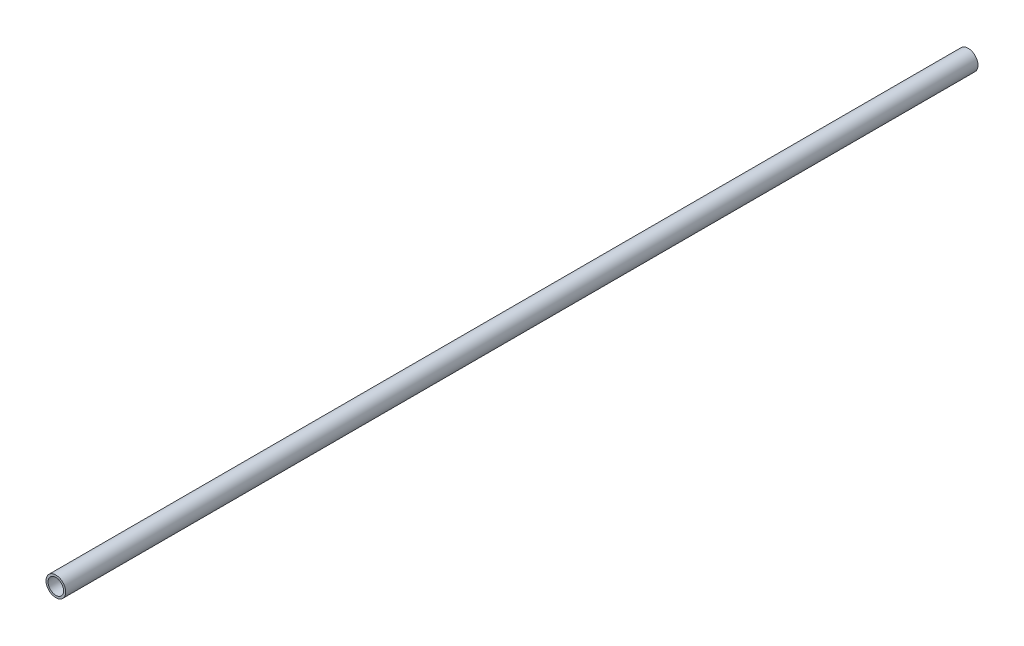
ISO-10303-21;
HEADER;
FILE_DESCRIPTION(('STEP AP214'),'2;1');
FILE_NAME('part.step','',(''),(''),'','','');
FILE_SCHEMA(('AUTOMOTIVE_DESIGN { 1 0 10303 214 1 1 1 1 }'));
ENDSEC;
DATA;
#1=APPLICATION_CONTEXT('core data for automotive mechanical design processes');
#2=APPLICATION_PROTOCOL_DEFINITION('international standard','automotive_design',2000,#1);
#3=PRODUCT_CONTEXT('',#1,'mechanical');
#4=PRODUCT('Part','Part','',(#3));
#5=PRODUCT_RELATED_PRODUCT_CATEGORY('part','',(#4));
#6=PRODUCT_DEFINITION_FORMATION('','',#4);
#7=PRODUCT_DEFINITION_CONTEXT('part definition',#1,'design');
#8=PRODUCT_DEFINITION('design','',#6,#7);
#9=PRODUCT_DEFINITION_SHAPE('','',#8);
#10=(LENGTH_UNIT() NAMED_UNIT(*) SI_UNIT(.MILLI.,.METRE.));
#11=(NAMED_UNIT(*) PLANE_ANGLE_UNIT() SI_UNIT($,.RADIAN.));
#12=(NAMED_UNIT(*) SI_UNIT($,.STERADIAN.) SOLID_ANGLE_UNIT());
#13=UNCERTAINTY_MEASURE_WITH_UNIT(LENGTH_MEASURE(1.E-05),#10,'distance_accuracy_value','');
#14=(GEOMETRIC_REPRESENTATION_CONTEXT(3) GLOBAL_UNCERTAINTY_ASSIGNED_CONTEXT((#13)) GLOBAL_UNIT_ASSIGNED_CONTEXT((#10,
#11,#12)) REPRESENTATION_CONTEXT('',''));
#15=CARTESIAN_POINT('',(0.,0.,0.));
#16=DIRECTION('',(0.,0.,1.));
#17=DIRECTION('',(1.,0.,0.));
#18=AXIS2_PLACEMENT_3D('',#15,#16,#17);
#19=CARTESIAN_POINT('',(0.,0.,558.8));
#20=DIRECTION('',(0.,0.,1.));
#21=DIRECTION('',(1.,0.,0.));
#22=AXIS2_PLACEMENT_3D('',#19,#20,#21);
#23=PLANE('',#22);
#24=CARTESIAN_POINT('',(0.,0.,558.8));
#25=DIRECTION('',(0.,0.,1.));
#26=DIRECTION('',(1.,0.,0.));
#27=AXIS2_PLACEMENT_3D('',#24,#25,#26);
#28=CIRCLE('',#27,12.065);
#29=CARTESIAN_POINT('',(12.065,0.,558.8));
#30=VERTEX_POINT('',#29);
#31=EDGE_CURVE('E10',#30,#30,#28,.T.);
#32=ORIENTED_EDGE('',*,*,#31,.T.);
#33=EDGE_LOOP('',(#32));
#34=FACE_BOUND('',#33,.T.);
#35=CARTESIAN_POINT('',(0.,0.,558.8));
#36=DIRECTION('',(0.,0.,1.));
#37=DIRECTION('',(1.,0.,0.));
#38=AXIS2_PLACEMENT_3D('',#35,#36,#37);
#39=CIRCLE('',#38,9.525);
#40=CARTESIAN_POINT('',(9.525,0.,558.8));
#41=VERTEX_POINT('',#40);
#42=EDGE_CURVE('E48',#41,#41,#39,.T.);
#43=ORIENTED_EDGE('',*,*,#42,.F.);
#44=EDGE_LOOP('',(#43));
#45=FACE_BOUND('',#44,.T.);
#46=ADVANCED_FACE('F37',(#34,#45),#23,.T.);
#47=CARTESIAN_POINT('',(0.,0.,-558.8));
#48=DIRECTION('',(0.,0.,1.));
#49=DIRECTION('',(1.,0.,0.));
#50=AXIS2_PLACEMENT_3D('',#47,#48,#49);
#51=PLANE('',#50);
#52=CARTESIAN_POINT('',(0.,0.,-558.8));
#53=DIRECTION('',(0.,0.,1.));
#54=DIRECTION('',(1.,0.,0.));
#55=AXIS2_PLACEMENT_3D('',#52,#53,#54);
#56=CIRCLE('',#55,12.065);
#57=CARTESIAN_POINT('',(12.065,0.,-558.8));
#58=VERTEX_POINT('',#57);
#59=EDGE_CURVE('E41',#58,#58,#56,.T.);
#60=ORIENTED_EDGE('',*,*,#59,.F.);
#61=EDGE_LOOP('',(#60));
#62=FACE_BOUND('',#61,.T.);
#63=CARTESIAN_POINT('',(0.,0.,-558.8));
#64=DIRECTION('',(0.,0.,1.));
#65=DIRECTION('',(1.,0.,0.));
#66=AXIS2_PLACEMENT_3D('',#63,#64,#65);
#67=CIRCLE('',#66,9.525);
#68=CARTESIAN_POINT('',(9.525,0.,-558.8));
#69=VERTEX_POINT('',#68);
#70=EDGE_CURVE('E50',#69,#69,#67,.T.);
#71=ORIENTED_EDGE('',*,*,#70,.T.);
#72=EDGE_LOOP('',(#71));
#73=FACE_BOUND('',#72,.T.);
#74=ADVANCED_FACE('F60',(#62,#73),#51,.F.);
#75=CARTESIAN_POINT('',(0.,0.,558.8));
#76=DIRECTION('',(0.,0.,-1.));
#77=DIRECTION('',(-1.,0.,0.));
#78=AXIS2_PLACEMENT_3D('',#75,#76,#77);
#79=CYLINDRICAL_SURFACE('',#78,12.065);
#80=ORIENTED_EDGE('',*,*,#31,.F.);
#81=EDGE_LOOP('',(#80));
#82=FACE_BOUND('',#81,.T.);
#83=ORIENTED_EDGE('',*,*,#59,.T.);
#84=EDGE_LOOP('',(#83));
#85=FACE_BOUND('',#84,.T.);
#86=ADVANCED_FACE('F39',(#82,#85),#79,.T.);
#87=CARTESIAN_POINT('',(0.,0.,558.8));
#88=DIRECTION('',(0.,0.,-1.));
#89=DIRECTION('',(-1.,0.,0.));
#90=AXIS2_PLACEMENT_3D('',#87,#88,#89);
#91=CYLINDRICAL_SURFACE('',#90,9.525);
#92=ORIENTED_EDGE('',*,*,#42,.T.);
#93=EDGE_LOOP('',(#92));
#94=FACE_BOUND('',#93,.T.);
#95=ORIENTED_EDGE('',*,*,#70,.F.);
#96=EDGE_LOOP('',(#95));
#97=FACE_BOUND('',#96,.T.);
#98=ADVANCED_FACE('F56',(#94,#97),#91,.F.);
#99=CLOSED_SHELL('',(#46,#74,#86,#98));
#100=MANIFOLD_SOLID_BREP('B2',#99);
#101=ADVANCED_BREP_SHAPE_REPRESENTATION('',(#18,#100),#14);
#102=SHAPE_DEFINITION_REPRESENTATION(#9,#101);
ENDSEC;
END-ISO-10303-21;
